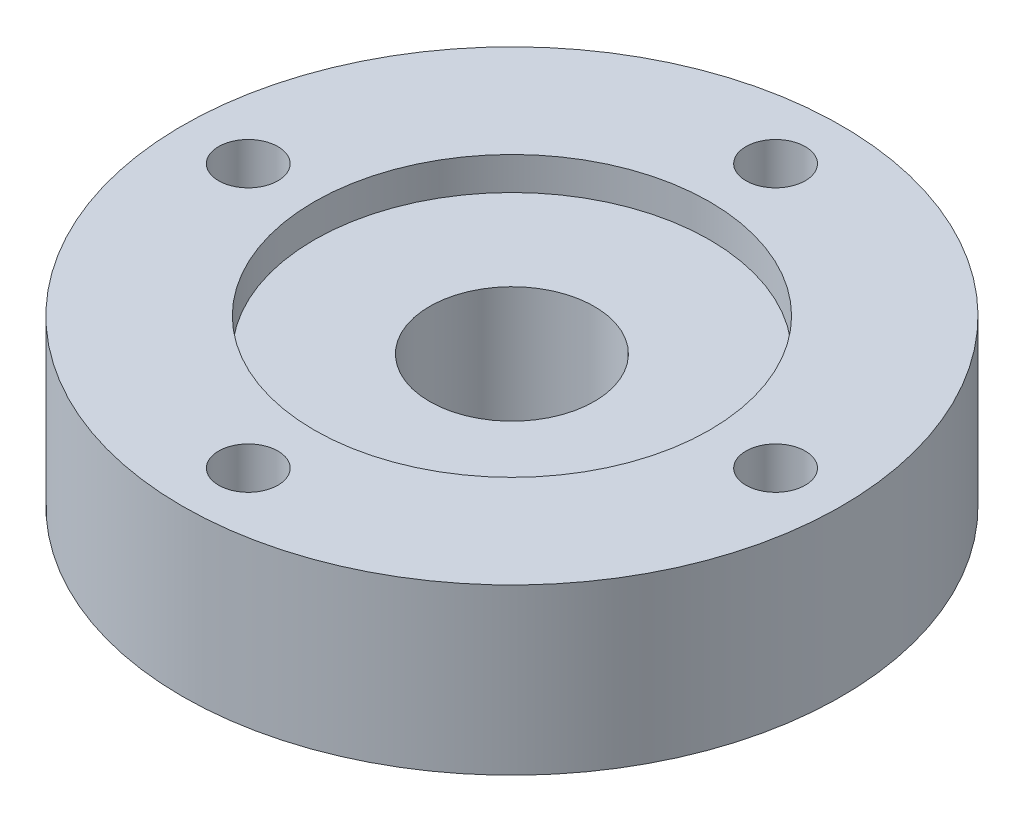
ISO-10303-21;
HEADER;
FILE_DESCRIPTION(('STEP AP214'),'2;1');
FILE_NAME('part.step','',(''),(''),'','','');
FILE_SCHEMA(('AUTOMOTIVE_DESIGN { 1 0 10303 214 1 1 1 1 }'));
ENDSEC;
DATA;
#1=APPLICATION_CONTEXT('core data for automotive mechanical design processes');
#2=APPLICATION_PROTOCOL_DEFINITION('international standard','automotive_design',2000,#1);
#3=PRODUCT_CONTEXT('',#1,'mechanical');
#4=PRODUCT('Part','Part','',(#3));
#5=PRODUCT_RELATED_PRODUCT_CATEGORY('part','',(#4));
#6=PRODUCT_DEFINITION_FORMATION('','',#4);
#7=PRODUCT_DEFINITION_CONTEXT('part definition',#1,'design');
#8=PRODUCT_DEFINITION('design','',#6,#7);
#9=PRODUCT_DEFINITION_SHAPE('','',#8);
#10=(LENGTH_UNIT() NAMED_UNIT(*) SI_UNIT(.MILLI.,.METRE.));
#11=(NAMED_UNIT(*) PLANE_ANGLE_UNIT() SI_UNIT($,.RADIAN.));
#12=(NAMED_UNIT(*) SI_UNIT($,.STERADIAN.) SOLID_ANGLE_UNIT());
#13=UNCERTAINTY_MEASURE_WITH_UNIT(LENGTH_MEASURE(1.E-05),#10,'distance_accuracy_value','');
#14=(GEOMETRIC_REPRESENTATION_CONTEXT(3) GLOBAL_UNCERTAINTY_ASSIGNED_CONTEXT((#13)) GLOBAL_UNIT_ASSIGNED_CONTEXT((#10,
#11,#12)) REPRESENTATION_CONTEXT('',''));
#15=CARTESIAN_POINT('',(0.,0.,0.));
#16=DIRECTION('',(0.,0.,1.));
#17=DIRECTION('',(1.,0.,0.));
#18=AXIS2_PLACEMENT_3D('',#15,#16,#17);
#19=CARTESIAN_POINT('',(0.,5.,0.));
#20=DIRECTION('',(0.,-1.,0.));
#21=DIRECTION('',(0.,0.,-1.));
#22=AXIS2_PLACEMENT_3D('',#19,#20,#21);
#23=CYLINDRICAL_SURFACE('',#22,2.5);
#24=CARTESIAN_POINT('',(0.,0.,0.));
#25=DIRECTION('',(0.,1.,0.));
#26=DIRECTION('',(0.,0.,1.));
#27=AXIS2_PLACEMENT_3D('',#24,#25,#26);
#28=CIRCLE('',#27,2.5);
#29=CARTESIAN_POINT('',(0.,0.,2.5));
#30=VERTEX_POINT('',#29);
#31=EDGE_CURVE('E52',#30,#30,#28,.T.);
#32=ORIENTED_EDGE('',*,*,#31,.F.);
#33=EDGE_LOOP('',(#32));
#34=FACE_BOUND('',#33,.T.);
#35=CARTESIAN_POINT('',(0.,4.,0.));
#36=DIRECTION('',(0.,1.,0.));
#37=DIRECTION('',(0.,0.,1.));
#38=AXIS2_PLACEMENT_3D('',#35,#36,#37);
#39=CIRCLE('',#38,2.5);
#40=CARTESIAN_POINT('',(0.,4.,2.5));
#41=VERTEX_POINT('',#40);
#42=EDGE_CURVE('E43',#41,#41,#39,.T.);
#43=ORIENTED_EDGE('',*,*,#42,.T.);
#44=EDGE_LOOP('',(#43));
#45=FACE_BOUND('',#44,.T.);
#46=ADVANCED_FACE('F39',(#34,#45),#23,.F.);
#47=CARTESIAN_POINT('',(0.,5.,0.));
#48=DIRECTION('',(0.,1.,0.));
#49=DIRECTION('',(0.,0.,1.));
#50=AXIS2_PLACEMENT_3D('',#47,#48,#49);
#51=PLANE('',#50);
#52=CARTESIAN_POINT('',(0.,5.,-8.));
#53=DIRECTION('',(0.,1.,0.));
#54=DIRECTION('',(0.,0.,1.));
#55=AXIS2_PLACEMENT_3D('',#52,#53,#54);
#56=CIRCLE('',#55,0.9);
#57=CARTESIAN_POINT('',(0.,5.,-7.1));
#58=VERTEX_POINT('',#57);
#59=EDGE_CURVE('E81',#58,#58,#56,.T.);
#60=ORIENTED_EDGE('',*,*,#59,.F.);
#61=EDGE_LOOP('',(#60));
#62=FACE_BOUND('',#61,.T.);
#63=CARTESIAN_POINT('',(8.00000000000023,5.,-2.25904099284255E-13));
#64=DIRECTION('',(0.,1.,0.));
#65=DIRECTION('',(0.,0.,1.));
#66=AXIS2_PLACEMENT_3D('',#63,#64,#65);
#67=CIRCLE('',#66,0.9);
#68=CARTESIAN_POINT('',(8.00000000000023,5.,0.899999999999774));
#69=VERTEX_POINT('',#68);
#70=EDGE_CURVE('E75',#69,#69,#67,.T.);
#71=ORIENTED_EDGE('',*,*,#70,.F.);
#72=EDGE_LOOP('',(#71));
#73=FACE_BOUND('',#72,.T.);
#74=CARTESIAN_POINT('',(4.51808198568511E-13,5.,8.));
#75=DIRECTION('',(0.,1.,0.));
#76=DIRECTION('',(0.,0.,1.));
#77=AXIS2_PLACEMENT_3D('',#74,#75,#76);
#78=CIRCLE('',#77,0.9);
#79=CARTESIAN_POINT('',(4.51808198568511E-13,5.,8.9));
#80=VERTEX_POINT('',#79);
#81=EDGE_CURVE('E69',#80,#80,#78,.T.);
#82=ORIENTED_EDGE('',*,*,#81,.F.);
#83=EDGE_LOOP('',(#82));
#84=FACE_BOUND('',#83,.T.);
#85=CARTESIAN_POINT('',(-7.99999999999977,5.,2.26883816723573E-13));
#86=DIRECTION('',(0.,1.,0.));
#87=DIRECTION('',(0.,0.,1.));
#88=AXIS2_PLACEMENT_3D('',#85,#86,#87);
#89=CIRCLE('',#88,0.899999999999999);
#90=CARTESIAN_POINT('',(-7.99999999999977,5.,0.900000000000226));
#91=VERTEX_POINT('',#90);
#92=EDGE_CURVE('E63',#91,#91,#89,.T.);
#93=ORIENTED_EDGE('',*,*,#92,.F.);
#94=EDGE_LOOP('',(#93));
#95=FACE_BOUND('',#94,.T.);
#96=CARTESIAN_POINT('',(0.,5.,0.));
#97=DIRECTION('',(0.,1.,0.));
#98=DIRECTION('',(0.,0.,1.));
#99=AXIS2_PLACEMENT_3D('',#96,#97,#98);
#100=CIRCLE('',#99,6.);
#101=CARTESIAN_POINT('',(0.,5.,6.));
#102=VERTEX_POINT('',#101);
#103=EDGE_CURVE('E56',#102,#102,#100,.T.);
#104=ORIENTED_EDGE('',*,*,#103,.F.);
#105=EDGE_LOOP('',(#104));
#106=FACE_BOUND('',#105,.T.);
#107=CARTESIAN_POINT('',(0.,5.,0.));
#108=DIRECTION('',(0.,1.,0.));
#109=DIRECTION('',(0.,0.,1.));
#110=AXIS2_PLACEMENT_3D('',#107,#108,#109);
#111=CIRCLE('',#110,10.);
#112=CARTESIAN_POINT('',(0.,5.,10.));
#113=VERTEX_POINT('',#112);
#114=EDGE_CURVE('E10',#113,#113,#111,.T.);
#115=ORIENTED_EDGE('',*,*,#114,.T.);
#116=EDGE_LOOP('',(#115));
#117=FACE_BOUND('',#116,.T.);
#118=ADVANCED_FACE('F97',(#62,#73,#84,#95,#106,#117),#51,.T.);
#119=CARTESIAN_POINT('',(0.,0.,0.));
#120=DIRECTION('',(0.,1.,0.));
#121=DIRECTION('',(0.,0.,1.));
#122=AXIS2_PLACEMENT_3D('',#119,#120,#121);
#123=PLANE('',#122);
#124=CARTESIAN_POINT('',(0.,0.,-8.));
#125=DIRECTION('',(0.,1.,0.));
#126=DIRECTION('',(0.,0.,1.));
#127=AXIS2_PLACEMENT_3D('',#124,#125,#126);
#128=CIRCLE('',#127,0.9);
#129=CARTESIAN_POINT('',(0.,0.,-7.1));
#130=VERTEX_POINT('',#129);
#131=EDGE_CURVE('E60',#130,#130,#128,.T.);
#132=ORIENTED_EDGE('',*,*,#131,.T.);
#133=EDGE_LOOP('',(#132));
#134=FACE_BOUND('',#133,.T.);
#135=CARTESIAN_POINT('',(8.00000000000023,0.,-2.25904099284255E-13));
#136=DIRECTION('',(0.,1.,0.));
#137=DIRECTION('',(0.,0.,1.));
#138=AXIS2_PLACEMENT_3D('',#135,#136,#137);
#139=CIRCLE('',#138,0.9);
#140=CARTESIAN_POINT('',(8.00000000000023,0.,0.899999999999774));
#141=VERTEX_POINT('',#140);
#142=EDGE_CURVE('E78',#141,#141,#139,.T.);
#143=ORIENTED_EDGE('',*,*,#142,.T.);
#144=EDGE_LOOP('',(#143));
#145=FACE_BOUND('',#144,.T.);
#146=CARTESIAN_POINT('',(4.51808198568511E-13,0.,8.));
#147=DIRECTION('',(0.,1.,0.));
#148=DIRECTION('',(0.,0.,1.));
#149=AXIS2_PLACEMENT_3D('',#146,#147,#148);
#150=CIRCLE('',#149,0.9);
#151=CARTESIAN_POINT('',(4.51808198568511E-13,0.,8.9));
#152=VERTEX_POINT('',#151);
#153=EDGE_CURVE('E72',#152,#152,#150,.T.);
#154=ORIENTED_EDGE('',*,*,#153,.T.);
#155=EDGE_LOOP('',(#154));
#156=FACE_BOUND('',#155,.T.);
#157=CARTESIAN_POINT('',(-7.99999999999977,0.,2.26883816723573E-13));
#158=DIRECTION('',(0.,1.,0.));
#159=DIRECTION('',(0.,0.,1.));
#160=AXIS2_PLACEMENT_3D('',#157,#158,#159);
#161=CIRCLE('',#160,0.899999999999999);
#162=CARTESIAN_POINT('',(-7.99999999999977,0.,0.900000000000226));
#163=VERTEX_POINT('',#162);
#164=EDGE_CURVE('E66',#163,#163,#161,.T.);
#165=ORIENTED_EDGE('',*,*,#164,.T.);
#166=EDGE_LOOP('',(#165));
#167=FACE_BOUND('',#166,.T.);
#168=CARTESIAN_POINT('',(0.,0.,0.));
#169=DIRECTION('',(0.,1.,0.));
#170=DIRECTION('',(0.,0.,1.));
#171=AXIS2_PLACEMENT_3D('',#168,#169,#170);
#172=CIRCLE('',#171,10.);
#173=CARTESIAN_POINT('',(0.,0.,10.));
#174=VERTEX_POINT('',#173);
#175=EDGE_CURVE('E47',#174,#174,#172,.T.);
#176=ORIENTED_EDGE('',*,*,#175,.F.);
#177=EDGE_LOOP('',(#176));
#178=FACE_BOUND('',#177,.T.);
#179=ORIENTED_EDGE('',*,*,#31,.T.);
#180=EDGE_LOOP('',(#179));
#181=FACE_BOUND('',#180,.T.);
#182=ADVANCED_FACE('F87',(#134,#145,#156,#167,#178,#181),#123,.F.);
#183=CARTESIAN_POINT('',(0.,5.,0.));
#184=DIRECTION('',(0.,-1.,0.));
#185=DIRECTION('',(0.,0.,-1.));
#186=AXIS2_PLACEMENT_3D('',#183,#184,#185);
#187=CYLINDRICAL_SURFACE('',#186,10.);
#188=ORIENTED_EDGE('',*,*,#114,.F.);
#189=EDGE_LOOP('',(#188));
#190=FACE_BOUND('',#189,.T.);
#191=ORIENTED_EDGE('',*,*,#175,.T.);
#192=EDGE_LOOP('',(#191));
#193=FACE_BOUND('',#192,.T.);
#194=ADVANCED_FACE('F41',(#190,#193),#187,.T.);
#195=CARTESIAN_POINT('',(0.,4.,0.));
#196=DIRECTION('',(0.,1.,0.));
#197=DIRECTION('',(0.,0.,1.));
#198=AXIS2_PLACEMENT_3D('',#195,#196,#197);
#199=CYLINDRICAL_SURFACE('',#198,6.);
#200=CARTESIAN_POINT('',(0.,4.,0.));
#201=DIRECTION('',(0.,1.,0.));
#202=DIRECTION('',(0.,0.,1.));
#203=AXIS2_PLACEMENT_3D('',#200,#201,#202);
#204=CIRCLE('',#203,6.);
#205=CARTESIAN_POINT('',(0.,4.,6.));
#206=VERTEX_POINT('',#205);
#207=EDGE_CURVE('E59',#206,#206,#204,.T.);
#208=ORIENTED_EDGE('',*,*,#207,.F.);
#209=EDGE_LOOP('',(#208));
#210=FACE_BOUND('',#209,.T.);
#211=ORIENTED_EDGE('',*,*,#103,.T.);
#212=EDGE_LOOP('',(#211));
#213=FACE_BOUND('',#212,.T.);
#214=ADVANCED_FACE('F109',(#210,#213),#199,.F.);
#215=CARTESIAN_POINT('',(0.,4.,0.));
#216=DIRECTION('',(0.,1.,0.));
#217=DIRECTION('',(0.,0.,1.));
#218=AXIS2_PLACEMENT_3D('',#215,#216,#217);
#219=PLANE('',#218);
#220=ORIENTED_EDGE('',*,*,#42,.F.);
#221=EDGE_LOOP('',(#220));
#222=FACE_BOUND('',#221,.T.);
#223=ORIENTED_EDGE('',*,*,#207,.T.);
#224=EDGE_LOOP('',(#223));
#225=FACE_BOUND('',#224,.T.);
#226=ADVANCED_FACE('F111',(#222,#225),#219,.T.);
#227=CARTESIAN_POINT('',(-7.99999999999977,0.,2.26883816723573E-13));
#228=DIRECTION('',(0.,1.,0.));
#229=DIRECTION('',(0.,0.,1.));
#230=AXIS2_PLACEMENT_3D('',#227,#228,#229);
#231=CYLINDRICAL_SURFACE('',#230,0.899999999999999);
#232=ORIENTED_EDGE('',*,*,#164,.F.);
#233=EDGE_LOOP('',(#232));
#234=FACE_BOUND('',#233,.T.);
#235=ORIENTED_EDGE('',*,*,#92,.T.);
#236=EDGE_LOOP('',(#235));
#237=FACE_BOUND('',#236,.T.);
#238=ADVANCED_FACE('F118',(#234,#237),#231,.F.);
#239=CARTESIAN_POINT('',(4.51808198568511E-13,0.,8.));
#240=DIRECTION('',(0.,1.,0.));
#241=DIRECTION('',(0.,0.,1.));
#242=AXIS2_PLACEMENT_3D('',#239,#240,#241);
#243=CYLINDRICAL_SURFACE('',#242,0.9);
#244=ORIENTED_EDGE('',*,*,#153,.F.);
#245=EDGE_LOOP('',(#244));
#246=FACE_BOUND('',#245,.T.);
#247=ORIENTED_EDGE('',*,*,#81,.T.);
#248=EDGE_LOOP('',(#247));
#249=FACE_BOUND('',#248,.T.);
#250=ADVANCED_FACE('F168',(#246,#249),#243,.F.);
#251=CARTESIAN_POINT('',(8.00000000000023,0.,-2.25904099284255E-13));
#252=DIRECTION('',(0.,1.,0.));
#253=DIRECTION('',(0.,0.,1.));
#254=AXIS2_PLACEMENT_3D('',#251,#252,#253);
#255=CYLINDRICAL_SURFACE('',#254,0.9);
#256=ORIENTED_EDGE('',*,*,#142,.F.);
#257=EDGE_LOOP('',(#256));
#258=FACE_BOUND('',#257,.T.);
#259=ORIENTED_EDGE('',*,*,#70,.T.);
#260=EDGE_LOOP('',(#259));
#261=FACE_BOUND('',#260,.T.);
#262=ADVANCED_FACE('F93',(#258,#261),#255,.F.);
#263=CARTESIAN_POINT('',(0.,0.,-8.));
#264=DIRECTION('',(0.,1.,0.));
#265=DIRECTION('',(0.,0.,1.));
#266=AXIS2_PLACEMENT_3D('',#263,#264,#265);
#267=CYLINDRICAL_SURFACE('',#266,0.9);
#268=ORIENTED_EDGE('',*,*,#131,.F.);
#269=EDGE_LOOP('',(#268));
#270=FACE_BOUND('',#269,.T.);
#271=ORIENTED_EDGE('',*,*,#59,.T.);
#272=EDGE_LOOP('',(#271));
#273=FACE_BOUND('',#272,.T.);
#274=ADVANCED_FACE('F90',(#270,#273),#267,.F.);
#275=CLOSED_SHELL('',(#46,#118,#182,#194,#214,#226,#238,#250,#262,#274));
#276=MANIFOLD_SOLID_BREP('B2',#275);
#277=ADVANCED_BREP_SHAPE_REPRESENTATION('',(#18,#276),#14);
#278=SHAPE_DEFINITION_REPRESENTATION(#9,#277);
ENDSEC;
END-ISO-10303-21;
